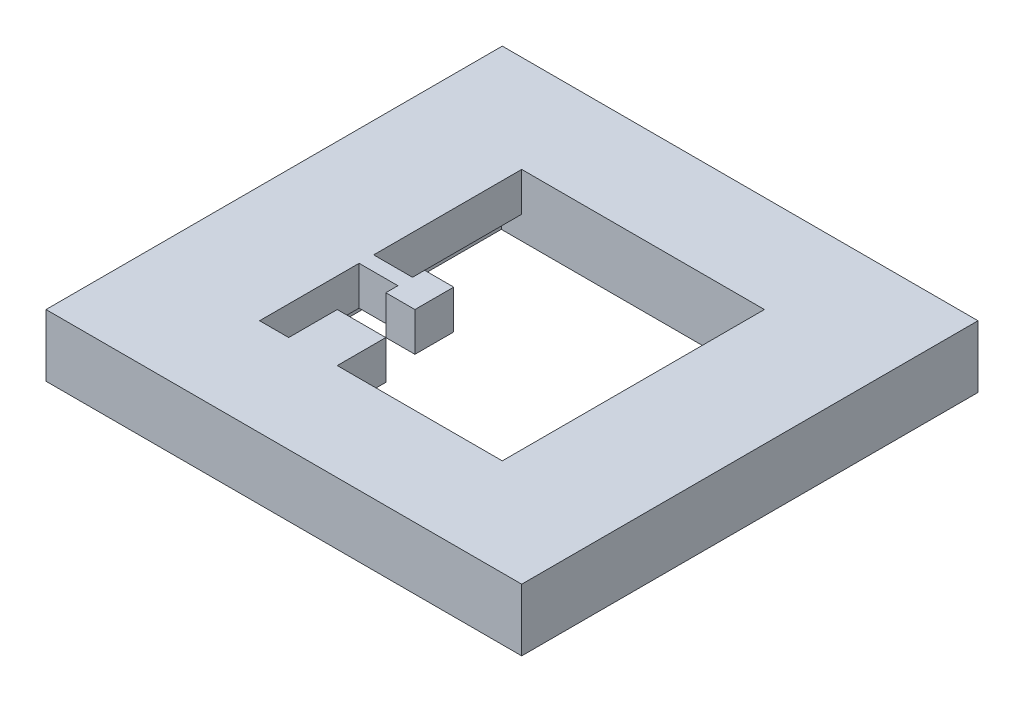
ISO-10303-21;
HEADER;
FILE_DESCRIPTION(('STEP AP214'),'2;1');
FILE_NAME('part.step','',(''),(''),'','','');
FILE_SCHEMA(('AUTOMOTIVE_DESIGN { 1 0 10303 214 1 1 1 1 }'));
ENDSEC;
DATA;
#1=APPLICATION_CONTEXT('core data for automotive mechanical design processes');
#2=APPLICATION_PROTOCOL_DEFINITION('international standard','automotive_design',2000,#1);
#3=PRODUCT_CONTEXT('',#1,'mechanical');
#4=PRODUCT('Part','Part','',(#3));
#5=PRODUCT_RELATED_PRODUCT_CATEGORY('part','',(#4));
#6=PRODUCT_DEFINITION_FORMATION('','',#4);
#7=PRODUCT_DEFINITION_CONTEXT('part definition',#1,'design');
#8=PRODUCT_DEFINITION('design','',#6,#7);
#9=PRODUCT_DEFINITION_SHAPE('','',#8);
#10=(LENGTH_UNIT() NAMED_UNIT(*) SI_UNIT(.MILLI.,.METRE.));
#11=(NAMED_UNIT(*) PLANE_ANGLE_UNIT() SI_UNIT($,.RADIAN.));
#12=(NAMED_UNIT(*) SI_UNIT($,.STERADIAN.) SOLID_ANGLE_UNIT());
#13=UNCERTAINTY_MEASURE_WITH_UNIT(LENGTH_MEASURE(1.E-05),#10,'distance_accuracy_value','');
#14=(GEOMETRIC_REPRESENTATION_CONTEXT(3) GLOBAL_UNCERTAINTY_ASSIGNED_CONTEXT((#13)) GLOBAL_UNIT_ASSIGNED_CONTEXT((#10,
#11,#12)) REPRESENTATION_CONTEXT('',''));
#15=CARTESIAN_POINT('',(0.,0.,0.));
#16=DIRECTION('',(0.,0.,1.));
#17=DIRECTION('',(1.,0.,0.));
#18=AXIS2_PLACEMENT_3D('',#15,#16,#17);
#19=CARTESIAN_POINT('',(0.,0.,0.));
#20=DIRECTION('',(0.,1.,0.));
#21=DIRECTION('',(0.,0.,1.));
#22=AXIS2_PLACEMENT_3D('',#19,#20,#21);
#23=PLANE('',#22);
#24=DIRECTION('',(0.,0.,1.));
#25=VECTOR('',#24,1.);
#26=CARTESIAN_POINT('',(-4.5,0.,13.5));
#27=LINE('',#26,#25);
#28=CARTESIAN_POINT('',(-4.5,0.,8.5));
#29=VERTEX_POINT('',#28);
#30=CARTESIAN_POINT('',(-4.5,0.,13.5));
#31=VERTEX_POINT('',#30);
#32=EDGE_CURVE('E286',#29,#31,#27,.T.);
#33=ORIENTED_EDGE('',*,*,#32,.T.);
#34=DIRECTION('',(-1.,0.,0.));
#35=VECTOR('',#34,1.);
#36=CARTESIAN_POINT('',(14.6,0.,13.5));
#37=LINE('',#36,#35);
#38=CARTESIAN_POINT('',(-9.5,0.,13.5));
#39=VERTEX_POINT('',#38);
#40=EDGE_CURVE('E11',#31,#39,#37,.T.);
#41=ORIENTED_EDGE('',*,*,#40,.T.);
#42=DIRECTION('',(0.,0.,-1.));
#43=VECTOR('',#42,1.);
#44=CARTESIAN_POINT('',(-9.5,0.,13.5));
#45=LINE('',#44,#43);
#46=CARTESIAN_POINT('',(-9.5,0.,8.5));
#47=VERTEX_POINT('',#46);
#48=EDGE_CURVE('E246',#39,#47,#45,.T.);
#49=ORIENTED_EDGE('',*,*,#48,.T.);
#50=DIRECTION('',(1.,0.,0.));
#51=VECTOR('',#50,1.);
#52=CARTESIAN_POINT('',(-9.5,0.,8.5));
#53=LINE('',#52,#51);
#54=EDGE_CURVE('E283',#47,#29,#53,.T.);
#55=ORIENTED_EDGE('',*,*,#54,.T.);
#56=EDGE_LOOP('',(#33,#41,#49,#55));
#57=FACE_BOUND('',#56,.T.);
#58=ADVANCED_FACE('F35',(#57),#23,.F.);
#59=DIRECTION('',(0.,0.,1.));
#60=VECTOR('',#59,1.);
#61=CARTESIAN_POINT('',(-12.5,0.,3.25));
#62=LINE('',#61,#60);
#63=CARTESIAN_POINT('',(-12.5,0.,3.25));
#64=VERTEX_POINT('',#63);
#65=CARTESIAN_POINT('',(-12.5,0.,13.5));
#66=VERTEX_POINT('',#65);
#67=EDGE_CURVE('E250',#64,#66,#62,.T.);
#68=ORIENTED_EDGE('',*,*,#67,.T.);
#69=CARTESIAN_POINT('',(-14.6,0.,13.5));
#70=VERTEX_POINT('',#69);
#71=EDGE_CURVE('E44',#66,#70,#37,.T.);
#72=ORIENTED_EDGE('',*,*,#71,.T.);
#73=DIRECTION('',(0.,0.,-1.));
#74=VECTOR('',#73,1.);
#75=CARTESIAN_POINT('',(-14.6,0.,-13.5));
#76=LINE('',#75,#74);
#77=CARTESIAN_POINT('',(-14.6,0.,-13.5));
#78=VERTEX_POINT('',#77);
#79=EDGE_CURVE('E226',#70,#78,#76,.T.);
#80=ORIENTED_EDGE('',*,*,#79,.T.);
#81=DIRECTION('',(1.,0.,0.));
#82=VECTOR('',#81,1.);
#83=CARTESIAN_POINT('',(14.6,0.,-13.5));
#84=LINE('',#83,#82);
#85=CARTESIAN_POINT('',(-12.5,0.,-13.5));
#86=VERTEX_POINT('',#85);
#87=EDGE_CURVE('E207',#78,#86,#84,.T.);
#88=ORIENTED_EDGE('',*,*,#87,.T.);
#89=DIRECTION('',(0.,0.,1.));
#90=VECTOR('',#89,1.);
#91=CARTESIAN_POINT('',(-12.5,0.,-13.5));
#92=LINE('',#91,#90);
#93=CARTESIAN_POINT('',(-12.5,0.,1.75));
#94=VERTEX_POINT('',#93);
#95=EDGE_CURVE('E292',#86,#94,#92,.T.);
#96=ORIENTED_EDGE('',*,*,#95,.T.);
#97=DIRECTION('',(1.,0.,0.));
#98=VECTOR('',#97,1.);
#99=CARTESIAN_POINT('',(-8.5,0.,1.75));
#100=LINE('',#99,#98);
#101=CARTESIAN_POINT('',(-8.5,0.,1.75));
#102=VERTEX_POINT('',#101);
#103=EDGE_CURVE('E295',#94,#102,#100,.T.);
#104=ORIENTED_EDGE('',*,*,#103,.T.);
#105=DIRECTION('',(0.,0.,-1.));
#106=VECTOR('',#105,1.);
#107=CARTESIAN_POINT('',(-8.5,0.,0.499999999999997));
#108=LINE('',#107,#106);
#109=CARTESIAN_POINT('',(-8.5,0.,0.499999999999997));
#110=VERTEX_POINT('',#109);
#111=EDGE_CURVE('E298',#102,#110,#108,.T.);
#112=ORIENTED_EDGE('',*,*,#111,.T.);
#113=DIRECTION('',(1.,0.,0.));
#114=VECTOR('',#113,1.);
#115=CARTESIAN_POINT('',(-8.5,0.,0.499999999999997));
#116=LINE('',#115,#114);
#117=CARTESIAN_POINT('',(-5.5,0.,0.499999999999997));
#118=VERTEX_POINT('',#117);
#119=EDGE_CURVE('E301',#110,#118,#116,.T.);
#120=ORIENTED_EDGE('',*,*,#119,.T.);
#121=DIRECTION('',(0.,0.,1.));
#122=VECTOR('',#121,1.);
#123=CARTESIAN_POINT('',(-5.5,0.,0.499999999999997));
#124=LINE('',#123,#122);
#125=CARTESIAN_POINT('',(-5.5,0.,4.5));
#126=VERTEX_POINT('',#125);
#127=EDGE_CURVE('E304',#118,#126,#124,.T.);
#128=ORIENTED_EDGE('',*,*,#127,.T.);
#129=DIRECTION('',(-1.,0.,0.));
#130=VECTOR('',#129,1.);
#131=CARTESIAN_POINT('',(-8.5,0.,4.5));
#132=LINE('',#131,#130);
#133=CARTESIAN_POINT('',(-8.5,0.,4.5));
#134=VERTEX_POINT('',#133);
#135=EDGE_CURVE('E307',#126,#134,#132,.T.);
#136=ORIENTED_EDGE('',*,*,#135,.T.);
#137=DIRECTION('',(0.,0.,-1.));
#138=VECTOR('',#137,1.);
#139=CARTESIAN_POINT('',(-8.5,0.,3.25));
#140=LINE('',#139,#138);
#141=CARTESIAN_POINT('',(-8.5,0.,3.25));
#142=VERTEX_POINT('',#141);
#143=EDGE_CURVE('E310',#134,#142,#140,.T.);
#144=ORIENTED_EDGE('',*,*,#143,.T.);
#145=DIRECTION('',(-1.,0.,0.));
#146=VECTOR('',#145,1.);
#147=CARTESIAN_POINT('',(-8.5,0.,3.25));
#148=LINE('',#147,#146);
#149=EDGE_CURVE('E313',#142,#64,#148,.T.);
#150=ORIENTED_EDGE('',*,*,#149,.T.);
#151=EDGE_LOOP('',(#68,#72,#80,#88,#96,#104,#112,#120,#128,#136,#144,#150));
#152=FACE_BOUND('',#151,.T.);
#153=ADVANCED_FACE('F378',(#152),#23,.F.);
#154=CARTESIAN_POINT('',(0.,4.,0.));
#155=DIRECTION('',(0.,1.,0.));
#156=DIRECTION('',(0.,0.,1.));
#157=AXIS2_PLACEMENT_3D('',#154,#155,#156);
#158=PLANE('',#157);
#159=DIRECTION('',(1.,0.,0.));
#160=VECTOR('',#159,1.);
#161=CARTESIAN_POINT('',(-24.5,4.,23.5));
#162=LINE('',#161,#160);
#163=CARTESIAN_POINT('',(-24.5,4.,23.5));
#164=VERTEX_POINT('',#163);
#165=CARTESIAN_POINT('',(24.5,4.,23.5));
#166=VERTEX_POINT('',#165);
#167=EDGE_CURVE('E353',#164,#166,#162,.T.);
#168=ORIENTED_EDGE('',*,*,#167,.T.);
#169=DIRECTION('',(0.,0.,-1.));
#170=VECTOR('',#169,1.);
#171=CARTESIAN_POINT('',(24.5,4.,23.5));
#172=LINE('',#171,#170);
#173=CARTESIAN_POINT('',(24.5,4.,-23.5));
#174=VERTEX_POINT('',#173);
#175=EDGE_CURVE('E356',#166,#174,#172,.T.);
#176=ORIENTED_EDGE('',*,*,#175,.T.);
#177=DIRECTION('',(-1.,0.,0.));
#178=VECTOR('',#177,1.);
#179=CARTESIAN_POINT('',(-24.5,4.,-23.5));
#180=LINE('',#179,#178);
#181=CARTESIAN_POINT('',(-24.5,4.,-23.5));
#182=VERTEX_POINT('',#181);
#183=EDGE_CURVE('E358',#174,#182,#180,.T.);
#184=ORIENTED_EDGE('',*,*,#183,.T.);
#185=DIRECTION('',(0.,0.,1.));
#186=VECTOR('',#185,1.);
#187=CARTESIAN_POINT('',(-24.5,4.,23.5));
#188=LINE('',#187,#186);
#189=EDGE_CURVE('E360',#182,#164,#188,.T.);
#190=ORIENTED_EDGE('',*,*,#189,.T.);
#191=EDGE_LOOP('',(#168,#176,#184,#190));
#192=FACE_BOUND('',#191,.T.);
#193=DIRECTION('',(1.,0.,0.));
#194=VECTOR('',#193,1.);
#195=CARTESIAN_POINT('',(-9.5,4.,8.5));
#196=LINE('',#195,#194);
#197=CARTESIAN_POINT('',(-9.5,4.,8.5));
#198=VERTEX_POINT('',#197);
#199=CARTESIAN_POINT('',(-4.5,4.,8.5));
#200=VERTEX_POINT('',#199);
#201=EDGE_CURVE('E249',#198,#200,#196,.T.);
#202=ORIENTED_EDGE('',*,*,#201,.F.);
#203=DIRECTION('',(0.,0.,-1.));
#204=VECTOR('',#203,1.);
#205=CARTESIAN_POINT('',(-9.5,4.,13.5));
#206=LINE('',#205,#204);
#207=CARTESIAN_POINT('',(-9.5,4.,13.5));
#208=VERTEX_POINT('',#207);
#209=EDGE_CURVE('E247',#208,#198,#206,.T.);
#210=ORIENTED_EDGE('',*,*,#209,.F.);
#211=DIRECTION('',(1.,0.,0.));
#212=VECTOR('',#211,1.);
#213=CARTESIAN_POINT('',(-12.5,4.,13.5));
#214=LINE('',#213,#212);
#215=CARTESIAN_POINT('',(-12.5,4.,13.5));
#216=VERTEX_POINT('',#215);
#217=EDGE_CURVE('E278',#216,#208,#214,.T.);
#218=ORIENTED_EDGE('',*,*,#217,.F.);
#219=DIRECTION('',(0.,0.,1.));
#220=VECTOR('',#219,1.);
#221=CARTESIAN_POINT('',(-12.5,4.,3.25));
#222=LINE('',#221,#220);
#223=CARTESIAN_POINT('',(-12.5,4.,3.25));
#224=VERTEX_POINT('',#223);
#225=EDGE_CURVE('E276',#224,#216,#222,.T.);
#226=ORIENTED_EDGE('',*,*,#225,.F.);
#227=DIRECTION('',(-1.,0.,0.));
#228=VECTOR('',#227,1.);
#229=CARTESIAN_POINT('',(-8.5,4.,3.25));
#230=LINE('',#229,#228);
#231=CARTESIAN_POINT('',(-8.5,4.,3.25));
#232=VERTEX_POINT('',#231);
#233=EDGE_CURVE('E274',#232,#224,#230,.T.);
#234=ORIENTED_EDGE('',*,*,#233,.F.);
#235=DIRECTION('',(0.,0.,-1.));
#236=VECTOR('',#235,1.);
#237=CARTESIAN_POINT('',(-8.5,4.,3.25));
#238=LINE('',#237,#236);
#239=CARTESIAN_POINT('',(-8.5,4.,4.5));
#240=VERTEX_POINT('',#239);
#241=EDGE_CURVE('E272',#240,#232,#238,.T.);
#242=ORIENTED_EDGE('',*,*,#241,.F.);
#243=DIRECTION('',(-1.,0.,0.));
#244=VECTOR('',#243,1.);
#245=CARTESIAN_POINT('',(-8.5,4.,4.5));
#246=LINE('',#245,#244);
#247=CARTESIAN_POINT('',(-5.5,4.,4.5));
#248=VERTEX_POINT('',#247);
#249=EDGE_CURVE('E270',#248,#240,#246,.T.);
#250=ORIENTED_EDGE('',*,*,#249,.F.);
#251=DIRECTION('',(0.,0.,1.));
#252=VECTOR('',#251,1.);
#253=CARTESIAN_POINT('',(-5.5,4.,0.499999999999997));
#254=LINE('',#253,#252);
#255=CARTESIAN_POINT('',(-5.5,4.,0.499999999999997));
#256=VERTEX_POINT('',#255);
#257=EDGE_CURVE('E268',#256,#248,#254,.T.);
#258=ORIENTED_EDGE('',*,*,#257,.F.);
#259=DIRECTION('',(1.,0.,0.));
#260=VECTOR('',#259,1.);
#261=CARTESIAN_POINT('',(-8.5,4.,0.499999999999997));
#262=LINE('',#261,#260);
#263=CARTESIAN_POINT('',(-8.5,4.,0.499999999999997));
#264=VERTEX_POINT('',#263);
#265=EDGE_CURVE('E266',#264,#256,#262,.T.);
#266=ORIENTED_EDGE('',*,*,#265,.F.);
#267=DIRECTION('',(0.,0.,-1.));
#268=VECTOR('',#267,1.);
#269=CARTESIAN_POINT('',(-8.5,4.,0.499999999999997));
#270=LINE('',#269,#268);
#271=CARTESIAN_POINT('',(-8.5,4.,1.75));
#272=VERTEX_POINT('',#271);
#273=EDGE_CURVE('E264',#272,#264,#270,.T.);
#274=ORIENTED_EDGE('',*,*,#273,.F.);
#275=DIRECTION('',(1.,0.,0.));
#276=VECTOR('',#275,1.);
#277=CARTESIAN_POINT('',(-8.5,4.,1.75));
#278=LINE('',#277,#276);
#279=CARTESIAN_POINT('',(-12.5,4.,1.75));
#280=VERTEX_POINT('',#279);
#281=EDGE_CURVE('E262',#280,#272,#278,.T.);
#282=ORIENTED_EDGE('',*,*,#281,.F.);
#283=DIRECTION('',(0.,0.,1.));
#284=VECTOR('',#283,1.);
#285=CARTESIAN_POINT('',(-12.5,4.,-13.5));
#286=LINE('',#285,#284);
#287=CARTESIAN_POINT('',(-12.5,4.,-13.5));
#288=VERTEX_POINT('',#287);
#289=EDGE_CURVE('E260',#288,#280,#286,.T.);
#290=ORIENTED_EDGE('',*,*,#289,.F.);
#291=DIRECTION('',(-1.,0.,0.));
#292=VECTOR('',#291,1.);
#293=CARTESIAN_POINT('',(-12.5,4.,-13.5));
#294=LINE('',#293,#292);
#295=CARTESIAN_POINT('',(12.5,4.,-13.5));
#296=VERTEX_POINT('',#295);
#297=EDGE_CURVE('E258',#296,#288,#294,.T.);
#298=ORIENTED_EDGE('',*,*,#297,.F.);
#299=DIRECTION('',(0.,0.,-1.));
#300=VECTOR('',#299,1.);
#301=CARTESIAN_POINT('',(12.5,4.,-13.5));
#302=LINE('',#301,#300);
#303=CARTESIAN_POINT('',(12.5,4.,13.5));
#304=VERTEX_POINT('',#303);
#305=EDGE_CURVE('E256',#304,#296,#302,.T.);
#306=ORIENTED_EDGE('',*,*,#305,.F.);
#307=DIRECTION('',(1.,0.,0.));
#308=VECTOR('',#307,1.);
#309=CARTESIAN_POINT('',(-4.5,4.,13.5));
#310=LINE('',#309,#308);
#311=CARTESIAN_POINT('',(-4.5,4.,13.5));
#312=VERTEX_POINT('',#311);
#313=EDGE_CURVE('E254',#312,#304,#310,.T.);
#314=ORIENTED_EDGE('',*,*,#313,.F.);
#315=DIRECTION('',(0.,0.,1.));
#316=VECTOR('',#315,1.);
#317=CARTESIAN_POINT('',(-4.5,4.,13.5));
#318=LINE('',#317,#316);
#319=EDGE_CURVE('E252',#200,#312,#318,.T.);
#320=ORIENTED_EDGE('',*,*,#319,.F.);
#321=EDGE_LOOP('',(#202,#210,#218,#226,#234,#242,#250,#258,#266,#274,#282,#290,#298,#306,#314,#320));
#322=FACE_BOUND('',#321,.T.);
#323=ADVANCED_FACE('F390',(#192,#322),#158,.T.);
#324=DIRECTION('',(0.,0.,1.));
#325=VECTOR('',#324,1.);
#326=CARTESIAN_POINT('',(14.6,0.,-13.5));
#327=LINE('',#326,#325);
#328=CARTESIAN_POINT('',(14.6,0.,-13.5));
#329=VERTEX_POINT('',#328);
#330=CARTESIAN_POINT('',(14.6,0.,13.5));
#331=VERTEX_POINT('',#330);
#332=EDGE_CURVE('E224',#329,#331,#327,.T.);
#333=ORIENTED_EDGE('',*,*,#332,.T.);
#334=CARTESIAN_POINT('',(12.5,0.,13.5));
#335=VERTEX_POINT('',#334);
#336=EDGE_CURVE('E46',#331,#335,#37,.T.);
#337=ORIENTED_EDGE('',*,*,#336,.T.);
#338=DIRECTION('',(0.,0.,-1.));
#339=VECTOR('',#338,1.);
#340=CARTESIAN_POINT('',(12.5,0.,-13.5));
#341=LINE('',#340,#339);
#342=CARTESIAN_POINT('',(12.5,0.,-13.5));
#343=VERTEX_POINT('',#342);
#344=EDGE_CURVE('E289',#335,#343,#341,.T.);
#345=ORIENTED_EDGE('',*,*,#344,.T.);
#346=EDGE_CURVE('E230',#343,#329,#84,.T.);
#347=ORIENTED_EDGE('',*,*,#346,.T.);
#348=EDGE_LOOP('',(#333,#337,#345,#347));
#349=FACE_BOUND('',#348,.T.);
#350=ADVANCED_FACE('F411',(#349),#23,.F.);
#351=CARTESIAN_POINT('',(-24.5,4.,23.5));
#352=DIRECTION('',(0.,0.,-1.));
#353=DIRECTION('',(-1.,0.,0.));
#354=AXIS2_PLACEMENT_3D('',#351,#352,#353);
#355=PLANE('',#354);
#356=DIRECTION('',(0.,-1.,0.));
#357=VECTOR('',#356,1.);
#358=CARTESIAN_POINT('',(-24.5,4.,23.5));
#359=LINE('',#358,#357);
#360=CARTESIAN_POINT('',(-24.5,-2.4,23.5));
#361=VERTEX_POINT('',#360);
#362=EDGE_CURVE('E362',#164,#361,#359,.T.);
#363=ORIENTED_EDGE('',*,*,#362,.T.);
#364=DIRECTION('',(-1.,0.,0.));
#365=VECTOR('',#364,1.);
#366=CARTESIAN_POINT('',(24.5,-2.4,23.5));
#367=LINE('',#366,#365);
#368=CARTESIAN_POINT('',(24.5,-2.4,23.5));
#369=VERTEX_POINT('',#368);
#370=EDGE_CURVE('E237',#369,#361,#367,.T.);
#371=ORIENTED_EDGE('',*,*,#370,.F.);
#372=DIRECTION('',(0.,-1.,0.));
#373=VECTOR('',#372,1.);
#374=CARTESIAN_POINT('',(24.5,4.,23.5));
#375=LINE('',#374,#373);
#376=EDGE_CURVE('E39',#166,#369,#375,.T.);
#377=ORIENTED_EDGE('',*,*,#376,.F.);
#378=ORIENTED_EDGE('',*,*,#167,.F.);
#379=EDGE_LOOP('',(#363,#371,#377,#378));
#380=FACE_BOUND('',#379,.T.);
#381=ADVANCED_FACE('F37',(#380),#355,.F.);
#382=CARTESIAN_POINT('',(24.5,4.,23.5));
#383=DIRECTION('',(-1.,0.,0.));
#384=DIRECTION('',(0.,0.,1.));
#385=AXIS2_PLACEMENT_3D('',#382,#383,#384);
#386=PLANE('',#385);
#387=ORIENTED_EDGE('',*,*,#376,.T.);
#388=DIRECTION('',(0.,0.,1.));
#389=VECTOR('',#388,1.);
#390=CARTESIAN_POINT('',(24.5,-2.4,-23.5));
#391=LINE('',#390,#389);
#392=CARTESIAN_POINT('',(24.5,-2.4,-23.5));
#393=VERTEX_POINT('',#392);
#394=EDGE_CURVE('E212',#393,#369,#391,.T.);
#395=ORIENTED_EDGE('',*,*,#394,.F.);
#396=DIRECTION('',(0.,-1.,0.));
#397=VECTOR('',#396,1.);
#398=CARTESIAN_POINT('',(24.5,4.,-23.5));
#399=LINE('',#398,#397);
#400=EDGE_CURVE('E365',#174,#393,#399,.T.);
#401=ORIENTED_EDGE('',*,*,#400,.F.);
#402=ORIENTED_EDGE('',*,*,#175,.F.);
#403=EDGE_LOOP('',(#387,#395,#401,#402));
#404=FACE_BOUND('',#403,.T.);
#405=ADVANCED_FACE('F418',(#404),#386,.F.);
#406=CARTESIAN_POINT('',(-24.5,4.,-23.5));
#407=DIRECTION('',(0.,0.,1.));
#408=DIRECTION('',(1.,0.,0.));
#409=AXIS2_PLACEMENT_3D('',#406,#407,#408);
#410=PLANE('',#409);
#411=ORIENTED_EDGE('',*,*,#400,.T.);
#412=DIRECTION('',(1.,0.,0.));
#413=VECTOR('',#412,1.);
#414=CARTESIAN_POINT('',(-24.5,-2.4,-23.5));
#415=LINE('',#414,#413);
#416=CARTESIAN_POINT('',(-24.5,-2.4,-23.5));
#417=VERTEX_POINT('',#416);
#418=EDGE_CURVE('E243',#417,#393,#415,.T.);
#419=ORIENTED_EDGE('',*,*,#418,.F.);
#420=DIRECTION('',(0.,-1.,0.));
#421=VECTOR('',#420,1.);
#422=CARTESIAN_POINT('',(-24.5,4.,-23.5));
#423=LINE('',#422,#421);
#424=EDGE_CURVE('E364',#182,#417,#423,.T.);
#425=ORIENTED_EDGE('',*,*,#424,.F.);
#426=ORIENTED_EDGE('',*,*,#183,.F.);
#427=EDGE_LOOP('',(#411,#419,#425,#426));
#428=FACE_BOUND('',#427,.T.);
#429=ADVANCED_FACE('F563',(#428),#410,.F.);
#430=CARTESIAN_POINT('',(-24.5,4.,23.5));
#431=DIRECTION('',(1.,0.,0.));
#432=DIRECTION('',(0.,0.,-1.));
#433=AXIS2_PLACEMENT_3D('',#430,#431,#432);
#434=PLANE('',#433);
#435=ORIENTED_EDGE('',*,*,#424,.T.);
#436=DIRECTION('',(0.,0.,-1.));
#437=VECTOR('',#436,1.);
#438=CARTESIAN_POINT('',(-24.5,-2.4,23.5));
#439=LINE('',#438,#437);
#440=EDGE_CURVE('E240',#361,#417,#439,.T.);
#441=ORIENTED_EDGE('',*,*,#440,.F.);
#442=ORIENTED_EDGE('',*,*,#362,.F.);
#443=ORIENTED_EDGE('',*,*,#189,.F.);
#444=EDGE_LOOP('',(#435,#441,#442,#443));
#445=FACE_BOUND('',#444,.T.);
#446=ADVANCED_FACE('F572',(#445),#434,.F.);
#447=CARTESIAN_POINT('',(-9.5,4.,13.5));
#448=DIRECTION('',(-1.,0.,0.));
#449=DIRECTION('',(0.,0.,1.));
#450=AXIS2_PLACEMENT_3D('',#447,#448,#449);
#451=PLANE('',#450);
#452=ORIENTED_EDGE('',*,*,#48,.F.);
#453=DIRECTION('',(0.,-1.,0.));
#454=VECTOR('',#453,1.);
#455=CARTESIAN_POINT('',(-9.5,4.,13.5));
#456=LINE('',#455,#454);
#457=EDGE_CURVE('E280',#208,#39,#456,.T.);
#458=ORIENTED_EDGE('',*,*,#457,.F.);
#459=ORIENTED_EDGE('',*,*,#209,.T.);
#460=DIRECTION('',(0.,-1.,0.));
#461=VECTOR('',#460,1.);
#462=CARTESIAN_POINT('',(-9.5,4.,8.5));
#463=LINE('',#462,#461);
#464=EDGE_CURVE('E350',#198,#47,#463,.T.);
#465=ORIENTED_EDGE('',*,*,#464,.T.);
#466=EDGE_LOOP('',(#452,#458,#459,#465));
#467=FACE_BOUND('',#466,.T.);
#468=ADVANCED_FACE('F394',(#467),#451,.T.);
#469=CARTESIAN_POINT('',(-9.5,4.,8.5));
#470=DIRECTION('',(0.,0.,-1.));
#471=DIRECTION('',(-1.,0.,0.));
#472=AXIS2_PLACEMENT_3D('',#469,#470,#471);
#473=PLANE('',#472);
#474=ORIENTED_EDGE('',*,*,#54,.F.);
#475=ORIENTED_EDGE('',*,*,#464,.F.);
#476=ORIENTED_EDGE('',*,*,#201,.T.);
#477=DIRECTION('',(0.,-1.,0.));
#478=VECTOR('',#477,1.);
#479=CARTESIAN_POINT('',(-4.5,4.,8.5));
#480=LINE('',#479,#478);
#481=EDGE_CURVE('E348',#200,#29,#480,.T.);
#482=ORIENTED_EDGE('',*,*,#481,.T.);
#483=EDGE_LOOP('',(#474,#475,#476,#482));
#484=FACE_BOUND('',#483,.T.);
#485=ADVANCED_FACE('F439',(#484),#473,.T.);
#486=CARTESIAN_POINT('',(-4.5,4.,13.5));
#487=DIRECTION('',(1.,0.,0.));
#488=DIRECTION('',(0.,0.,-1.));
#489=AXIS2_PLACEMENT_3D('',#486,#487,#488);
#490=PLANE('',#489);
#491=ORIENTED_EDGE('',*,*,#32,.F.);
#492=ORIENTED_EDGE('',*,*,#481,.F.);
#493=ORIENTED_EDGE('',*,*,#319,.T.);
#494=DIRECTION('',(0.,-1.,0.));
#495=VECTOR('',#494,1.);
#496=CARTESIAN_POINT('',(-4.5,4.,13.5));
#497=LINE('',#496,#495);
#498=EDGE_CURVE('E345',#312,#31,#497,.T.);
#499=ORIENTED_EDGE('',*,*,#498,.T.);
#500=EDGE_LOOP('',(#491,#492,#493,#499));
#501=FACE_BOUND('',#500,.T.);
#502=ADVANCED_FACE('F401',(#501),#490,.T.);
#503=CARTESIAN_POINT('',(-4.5,4.,13.5));
#504=DIRECTION('',(0.,0.,-1.));
#505=DIRECTION('',(-1.,0.,0.));
#506=AXIS2_PLACEMENT_3D('',#503,#504,#505);
#507=PLANE('',#506);
#508=DIRECTION('',(0.,-1.,0.));
#509=VECTOR('',#508,1.);
#510=CARTESIAN_POINT('',(12.5,4.,13.5));
#511=LINE('',#510,#509);
#512=EDGE_CURVE('E343',#304,#335,#511,.T.);
#513=ORIENTED_EDGE('',*,*,#512,.T.);
#514=ORIENTED_EDGE('',*,*,#336,.F.);
#515=DIRECTION('',(0.,1.,0.));
#516=VECTOR('',#515,1.);
#517=CARTESIAN_POINT('',(14.6,-2.4,13.5));
#518=LINE('',#517,#516);
#519=CARTESIAN_POINT('',(14.6,-2.4,13.5));
#520=VERTEX_POINT('',#519);
#521=EDGE_CURVE('E201',#520,#331,#518,.T.);
#522=ORIENTED_EDGE('',*,*,#521,.F.);
#523=DIRECTION('',(-1.,0.,0.));
#524=VECTOR('',#523,1.);
#525=CARTESIAN_POINT('',(14.6,-2.4,13.5));
#526=LINE('',#525,#524);
#527=CARTESIAN_POINT('',(-14.6,-2.4,13.5));
#528=VERTEX_POINT('',#527);
#529=EDGE_CURVE('E206',#520,#528,#526,.T.);
#530=ORIENTED_EDGE('',*,*,#529,.T.);
#531=DIRECTION('',(0.,1.,0.));
#532=VECTOR('',#531,1.);
#533=CARTESIAN_POINT('',(-14.6,-2.4,13.5));
#534=LINE('',#533,#532);
#535=EDGE_CURVE('E213',#528,#70,#534,.T.);
#536=ORIENTED_EDGE('',*,*,#535,.T.);
#537=ORIENTED_EDGE('',*,*,#71,.F.);
#538=DIRECTION('',(0.,-1.,0.));
#539=VECTOR('',#538,1.);
#540=CARTESIAN_POINT('',(-12.5,4.,13.5));
#541=LINE('',#540,#539);
#542=EDGE_CURVE('E61',#216,#66,#541,.T.);
#543=ORIENTED_EDGE('',*,*,#542,.F.);
#544=ORIENTED_EDGE('',*,*,#217,.T.);
#545=ORIENTED_EDGE('',*,*,#457,.T.);
#546=ORIENTED_EDGE('',*,*,#40,.F.);
#547=ORIENTED_EDGE('',*,*,#498,.F.);
#548=ORIENTED_EDGE('',*,*,#313,.T.);
#549=EDGE_LOOP('',(#513,#514,#522,#530,#536,#537,#543,#544,#545,#546,#547,#548));
#550=FACE_BOUND('',#549,.T.);
#551=ADVANCED_FACE('F210',(#550),#507,.T.);
#552=CARTESIAN_POINT('',(12.5,4.,-13.5));
#553=DIRECTION('',(-1.,0.,0.));
#554=DIRECTION('',(0.,0.,1.));
#555=AXIS2_PLACEMENT_3D('',#552,#553,#554);
#556=PLANE('',#555);
#557=ORIENTED_EDGE('',*,*,#344,.F.);
#558=ORIENTED_EDGE('',*,*,#512,.F.);
#559=ORIENTED_EDGE('',*,*,#305,.T.);
#560=DIRECTION('',(0.,-1.,0.));
#561=VECTOR('',#560,1.);
#562=CARTESIAN_POINT('',(12.5,4.,-13.5));
#563=LINE('',#562,#561);
#564=EDGE_CURVE('E340',#296,#343,#563,.T.);
#565=ORIENTED_EDGE('',*,*,#564,.T.);
#566=EDGE_LOOP('',(#557,#558,#559,#565));
#567=FACE_BOUND('',#566,.T.);
#568=ADVANCED_FACE('F409',(#567),#556,.T.);
#569=CARTESIAN_POINT('',(-12.5,4.,-13.5));
#570=DIRECTION('',(0.,0.,1.));
#571=DIRECTION('',(1.,0.,0.));
#572=AXIS2_PLACEMENT_3D('',#569,#570,#571);
#573=PLANE('',#572);
#574=DIRECTION('',(0.,-1.,0.));
#575=VECTOR('',#574,1.);
#576=CARTESIAN_POINT('',(-12.5,4.,-13.5));
#577=LINE('',#576,#575);
#578=EDGE_CURVE('E337',#288,#86,#577,.T.);
#579=ORIENTED_EDGE('',*,*,#578,.T.);
#580=ORIENTED_EDGE('',*,*,#87,.F.);
#581=DIRECTION('',(0.,1.,0.));
#582=VECTOR('',#581,1.);
#583=CARTESIAN_POINT('',(-14.6,-2.4,-13.5));
#584=LINE('',#583,#582);
#585=CARTESIAN_POINT('',(-14.6,-2.4,-13.5));
#586=VERTEX_POINT('',#585);
#587=EDGE_CURVE('E232',#586,#78,#584,.T.);
#588=ORIENTED_EDGE('',*,*,#587,.F.);
#589=DIRECTION('',(1.,0.,0.));
#590=VECTOR('',#589,1.);
#591=CARTESIAN_POINT('',(14.6,-2.4,-13.5));
#592=LINE('',#591,#590);
#593=CARTESIAN_POINT('',(14.6,-2.4,-13.5));
#594=VERTEX_POINT('',#593);
#595=EDGE_CURVE('E220',#586,#594,#592,.T.);
#596=ORIENTED_EDGE('',*,*,#595,.T.);
#597=DIRECTION('',(0.,1.,0.));
#598=VECTOR('',#597,1.);
#599=CARTESIAN_POINT('',(14.6,-2.4,-13.5));
#600=LINE('',#599,#598);
#601=EDGE_CURVE('E53',#594,#329,#600,.T.);
#602=ORIENTED_EDGE('',*,*,#601,.T.);
#603=ORIENTED_EDGE('',*,*,#346,.F.);
#604=ORIENTED_EDGE('',*,*,#564,.F.);
#605=ORIENTED_EDGE('',*,*,#297,.T.);
#606=EDGE_LOOP('',(#579,#580,#588,#596,#602,#603,#604,#605));
#607=FACE_BOUND('',#606,.T.);
#608=ADVANCED_FACE('F605',(#607),#573,.T.);
#609=CARTESIAN_POINT('',(-12.5,4.,-13.5));
#610=DIRECTION('',(1.,0.,0.));
#611=DIRECTION('',(0.,0.,-1.));
#612=AXIS2_PLACEMENT_3D('',#609,#610,#611);
#613=PLANE('',#612);
#614=ORIENTED_EDGE('',*,*,#95,.F.);
#615=ORIENTED_EDGE('',*,*,#578,.F.);
#616=ORIENTED_EDGE('',*,*,#289,.T.);
#617=DIRECTION('',(0.,-1.,0.));
#618=VECTOR('',#617,1.);
#619=CARTESIAN_POINT('',(-12.5,4.,1.75));
#620=LINE('',#619,#618);
#621=EDGE_CURVE('E335',#280,#94,#620,.T.);
#622=ORIENTED_EDGE('',*,*,#621,.T.);
#623=EDGE_LOOP('',(#614,#615,#616,#622));
#624=FACE_BOUND('',#623,.T.);
#625=ADVANCED_FACE('F459',(#624),#613,.T.);
#626=CARTESIAN_POINT('',(-8.5,4.,1.75));
#627=DIRECTION('',(0.,0.,-1.));
#628=DIRECTION('',(-1.,0.,0.));
#629=AXIS2_PLACEMENT_3D('',#626,#627,#628);
#630=PLANE('',#629);
#631=ORIENTED_EDGE('',*,*,#103,.F.);
#632=ORIENTED_EDGE('',*,*,#621,.F.);
#633=ORIENTED_EDGE('',*,*,#281,.T.);
#634=DIRECTION('',(0.,-1.,0.));
#635=VECTOR('',#634,1.);
#636=CARTESIAN_POINT('',(-8.5,4.,1.75));
#637=LINE('',#636,#635);
#638=EDGE_CURVE('E333',#272,#102,#637,.T.);
#639=ORIENTED_EDGE('',*,*,#638,.T.);
#640=EDGE_LOOP('',(#631,#632,#633,#639));
#641=FACE_BOUND('',#640,.T.);
#642=ADVANCED_FACE('F453',(#641),#630,.T.);
#643=CARTESIAN_POINT('',(-8.5,4.,0.499999999999997));
#644=DIRECTION('',(-1.,0.,0.));
#645=DIRECTION('',(0.,0.,1.));
#646=AXIS2_PLACEMENT_3D('',#643,#644,#645);
#647=PLANE('',#646);
#648=ORIENTED_EDGE('',*,*,#111,.F.);
#649=ORIENTED_EDGE('',*,*,#638,.F.);
#650=ORIENTED_EDGE('',*,*,#273,.T.);
#651=DIRECTION('',(0.,-1.,0.));
#652=VECTOR('',#651,1.);
#653=CARTESIAN_POINT('',(-8.5,4.,0.499999999999997));
#654=LINE('',#653,#652);
#655=EDGE_CURVE('E331',#264,#110,#654,.T.);
#656=ORIENTED_EDGE('',*,*,#655,.T.);
#657=EDGE_LOOP('',(#648,#649,#650,#656));
#658=FACE_BOUND('',#657,.T.);
#659=ADVANCED_FACE('F458',(#658),#647,.T.);
#660=CARTESIAN_POINT('',(-8.5,4.,0.499999999999997));
#661=DIRECTION('',(0.,0.,-1.));
#662=DIRECTION('',(-1.,0.,0.));
#663=AXIS2_PLACEMENT_3D('',#660,#661,#662);
#664=PLANE('',#663);
#665=ORIENTED_EDGE('',*,*,#119,.F.);
#666=ORIENTED_EDGE('',*,*,#655,.F.);
#667=ORIENTED_EDGE('',*,*,#265,.T.);
#668=DIRECTION('',(0.,-1.,0.));
#669=VECTOR('',#668,1.);
#670=CARTESIAN_POINT('',(-5.5,4.,0.499999999999997));
#671=LINE('',#670,#669);
#672=EDGE_CURVE('E329',#256,#118,#671,.T.);
#673=ORIENTED_EDGE('',*,*,#672,.T.);
#674=EDGE_LOOP('',(#665,#666,#667,#673));
#675=FACE_BOUND('',#674,.T.);
#676=ADVANCED_FACE('F471',(#675),#664,.T.);
#677=CARTESIAN_POINT('',(-5.5,4.,0.499999999999997));
#678=DIRECTION('',(1.,0.,0.));
#679=DIRECTION('',(0.,0.,-1.));
#680=AXIS2_PLACEMENT_3D('',#677,#678,#679);
#681=PLANE('',#680);
#682=ORIENTED_EDGE('',*,*,#127,.F.);
#683=ORIENTED_EDGE('',*,*,#672,.F.);
#684=ORIENTED_EDGE('',*,*,#257,.T.);
#685=DIRECTION('',(0.,-1.,0.));
#686=VECTOR('',#685,1.);
#687=CARTESIAN_POINT('',(-5.5,4.,4.5));
#688=LINE('',#687,#686);
#689=EDGE_CURVE('E327',#248,#126,#688,.T.);
#690=ORIENTED_EDGE('',*,*,#689,.T.);
#691=EDGE_LOOP('',(#682,#683,#684,#690));
#692=FACE_BOUND('',#691,.T.);
#693=ADVANCED_FACE('F481',(#692),#681,.T.);
#694=CARTESIAN_POINT('',(-8.5,4.,4.5));
#695=DIRECTION('',(0.,0.,1.));
#696=DIRECTION('',(1.,0.,0.));
#697=AXIS2_PLACEMENT_3D('',#694,#695,#696);
#698=PLANE('',#697);
#699=ORIENTED_EDGE('',*,*,#135,.F.);
#700=ORIENTED_EDGE('',*,*,#689,.F.);
#701=ORIENTED_EDGE('',*,*,#249,.T.);
#702=DIRECTION('',(0.,-1.,0.));
#703=VECTOR('',#702,1.);
#704=CARTESIAN_POINT('',(-8.5,4.,4.5));
#705=LINE('',#704,#703);
#706=EDGE_CURVE('E325',#240,#134,#705,.T.);
#707=ORIENTED_EDGE('',*,*,#706,.T.);
#708=EDGE_LOOP('',(#699,#700,#701,#707));
#709=FACE_BOUND('',#708,.T.);
#710=ADVANCED_FACE('F491',(#709),#698,.T.);
#711=CARTESIAN_POINT('',(-8.5,4.,3.25));
#712=DIRECTION('',(-1.,0.,0.));
#713=DIRECTION('',(0.,0.,1.));
#714=AXIS2_PLACEMENT_3D('',#711,#712,#713);
#715=PLANE('',#714);
#716=ORIENTED_EDGE('',*,*,#143,.F.);
#717=ORIENTED_EDGE('',*,*,#706,.F.);
#718=ORIENTED_EDGE('',*,*,#241,.T.);
#719=DIRECTION('',(0.,-1.,0.));
#720=VECTOR('',#719,1.);
#721=CARTESIAN_POINT('',(-8.5,4.,3.25));
#722=LINE('',#721,#720);
#723=EDGE_CURVE('E323',#232,#142,#722,.T.);
#724=ORIENTED_EDGE('',*,*,#723,.T.);
#725=EDGE_LOOP('',(#716,#717,#718,#724));
#726=FACE_BOUND('',#725,.T.);
#727=ADVANCED_FACE('F501',(#726),#715,.T.);
#728=CARTESIAN_POINT('',(-8.5,4.,3.25));
#729=DIRECTION('',(0.,0.,1.));
#730=DIRECTION('',(1.,0.,0.));
#731=AXIS2_PLACEMENT_3D('',#728,#729,#730);
#732=PLANE('',#731);
#733=ORIENTED_EDGE('',*,*,#149,.F.);
#734=ORIENTED_EDGE('',*,*,#723,.F.);
#735=ORIENTED_EDGE('',*,*,#233,.T.);
#736=DIRECTION('',(0.,-1.,0.));
#737=VECTOR('',#736,1.);
#738=CARTESIAN_POINT('',(-12.5,4.,3.25));
#739=LINE('',#738,#737);
#740=EDGE_CURVE('E321',#224,#64,#739,.T.);
#741=ORIENTED_EDGE('',*,*,#740,.T.);
#742=EDGE_LOOP('',(#733,#734,#735,#741));
#743=FACE_BOUND('',#742,.T.);
#744=ADVANCED_FACE('F511',(#743),#732,.T.);
#745=CARTESIAN_POINT('',(-12.5,4.,3.25));
#746=DIRECTION('',(1.,0.,0.));
#747=DIRECTION('',(0.,0.,-1.));
#748=AXIS2_PLACEMENT_3D('',#745,#746,#747);
#749=PLANE('',#748);
#750=ORIENTED_EDGE('',*,*,#67,.F.);
#751=ORIENTED_EDGE('',*,*,#740,.F.);
#752=ORIENTED_EDGE('',*,*,#225,.T.);
#753=ORIENTED_EDGE('',*,*,#542,.T.);
#754=EDGE_LOOP('',(#750,#751,#752,#753));
#755=FACE_BOUND('',#754,.T.);
#756=ADVANCED_FACE('F382',(#755),#749,.T.);
#757=CARTESIAN_POINT('',(0.,-2.4,0.));
#758=DIRECTION('',(0.,-1.,0.));
#759=DIRECTION('',(0.,0.,-1.));
#760=AXIS2_PLACEMENT_3D('',#757,#758,#759);
#761=PLANE('',#760);
#762=ORIENTED_EDGE('',*,*,#394,.T.);
#763=ORIENTED_EDGE('',*,*,#370,.T.);
#764=ORIENTED_EDGE('',*,*,#440,.T.);
#765=ORIENTED_EDGE('',*,*,#418,.T.);
#766=EDGE_LOOP('',(#762,#763,#764,#765));
#767=FACE_BOUND('',#766,.T.);
#768=ORIENTED_EDGE('',*,*,#529,.F.);
#769=DIRECTION('',(0.,0.,1.));
#770=VECTOR('',#769,1.);
#771=CARTESIAN_POINT('',(14.6,-2.4,-13.5));
#772=LINE('',#771,#770);
#773=EDGE_CURVE('E198',#594,#520,#772,.T.);
#774=ORIENTED_EDGE('',*,*,#773,.F.);
#775=ORIENTED_EDGE('',*,*,#595,.F.);
#776=DIRECTION('',(0.,0.,-1.));
#777=VECTOR('',#776,1.);
#778=CARTESIAN_POINT('',(-14.6,-2.4,-13.5));
#779=LINE('',#778,#777);
#780=EDGE_CURVE('E218',#528,#586,#779,.T.);
#781=ORIENTED_EDGE('',*,*,#780,.F.);
#782=EDGE_LOOP('',(#768,#774,#775,#781));
#783=FACE_BOUND('',#782,.T.);
#784=ADVANCED_FACE('F216',(#767,#783),#761,.T.);
#785=CARTESIAN_POINT('',(14.6,-2.4,-13.5));
#786=DIRECTION('',(-1.,0.,0.));
#787=DIRECTION('',(0.,0.,1.));
#788=AXIS2_PLACEMENT_3D('',#785,#786,#787);
#789=PLANE('',#788);
#790=ORIENTED_EDGE('',*,*,#332,.F.);
#791=ORIENTED_EDGE('',*,*,#601,.F.);
#792=ORIENTED_EDGE('',*,*,#773,.T.);
#793=ORIENTED_EDGE('',*,*,#521,.T.);
#794=EDGE_LOOP('',(#790,#791,#792,#793));
#795=FACE_BOUND('',#794,.T.);
#796=ADVANCED_FACE('F200',(#795),#789,.T.);
#797=CARTESIAN_POINT('',(-14.6,-2.4,-13.5));
#798=DIRECTION('',(1.,0.,0.));
#799=DIRECTION('',(0.,0.,-1.));
#800=AXIS2_PLACEMENT_3D('',#797,#798,#799);
#801=PLANE('',#800);
#802=ORIENTED_EDGE('',*,*,#79,.F.);
#803=ORIENTED_EDGE('',*,*,#535,.F.);
#804=ORIENTED_EDGE('',*,*,#780,.T.);
#805=ORIENTED_EDGE('',*,*,#587,.T.);
#806=EDGE_LOOP('',(#802,#803,#804,#805));
#807=FACE_BOUND('',#806,.T.);
#808=ADVANCED_FACE('F644',(#807),#801,.T.);
#809=CLOSED_SHELL('',(#58,#153,#323,#350,#381,#405,#429,#446,#468,#485,#502,#551,#568,#608,#625,
#642,#659,#676,#693,#710,#727,#744,#756,#784,#796,#808));
#810=MANIFOLD_SOLID_BREP('B2',#809);
#811=ADVANCED_BREP_SHAPE_REPRESENTATION('',(#18,#810),#14);
#812=SHAPE_DEFINITION_REPRESENTATION(#9,#811);
ENDSEC;
END-ISO-10303-21;
